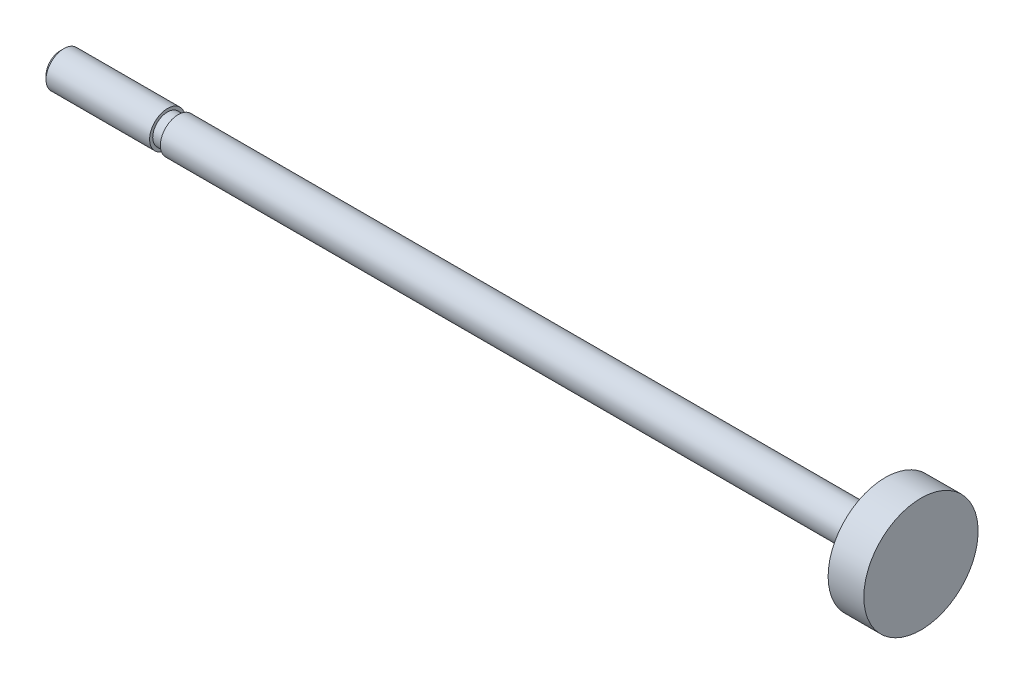
ISO-10303-21;
HEADER;
FILE_DESCRIPTION(('STEP AP214'),'2;1');
FILE_NAME('part.step','',(''),(''),'','','');
FILE_SCHEMA(('AUTOMOTIVE_DESIGN { 1 0 10303 214 1 1 1 1 }'));
ENDSEC;
DATA;
#1=APPLICATION_CONTEXT('core data for automotive mechanical design processes');
#2=APPLICATION_PROTOCOL_DEFINITION('international standard','automotive_design',2000,#1);
#3=PRODUCT_CONTEXT('',#1,'mechanical');
#4=PRODUCT('Part','Part','',(#3));
#5=PRODUCT_RELATED_PRODUCT_CATEGORY('part','',(#4));
#6=PRODUCT_DEFINITION_FORMATION('','',#4);
#7=PRODUCT_DEFINITION_CONTEXT('part definition',#1,'design');
#8=PRODUCT_DEFINITION('design','',#6,#7);
#9=PRODUCT_DEFINITION_SHAPE('','',#8);
#10=(LENGTH_UNIT() NAMED_UNIT(*) SI_UNIT(.MILLI.,.METRE.));
#11=(NAMED_UNIT(*) PLANE_ANGLE_UNIT() SI_UNIT($,.RADIAN.));
#12=(NAMED_UNIT(*) SI_UNIT($,.STERADIAN.) SOLID_ANGLE_UNIT());
#13=UNCERTAINTY_MEASURE_WITH_UNIT(LENGTH_MEASURE(1.E-05),#10,'distance_accuracy_value','');
#14=(GEOMETRIC_REPRESENTATION_CONTEXT(3) GLOBAL_UNCERTAINTY_ASSIGNED_CONTEXT((#13)) GLOBAL_UNIT_ASSIGNED_CONTEXT((#10,
#11,#12)) REPRESENTATION_CONTEXT('',''));
#15=CARTESIAN_POINT('',(0.,0.,0.));
#16=DIRECTION('',(0.,0.,1.));
#17=DIRECTION('',(1.,0.,0.));
#18=AXIS2_PLACEMENT_3D('',#15,#16,#17);
#19=CARTESIAN_POINT('',(0.,-2.0095,2.0095));
#20=DIRECTION('',(-1.,0.,0.));
#21=DIRECTION('',(0.,1.,0.));
#22=AXIS2_PLACEMENT_3D('',#19,#20,#21);
#23=PLANE('',#22);
#24=CARTESIAN_POINT('',(0.,0.,0.));
#25=DIRECTION('',(-1.,0.,0.));
#26=DIRECTION('',(0.,0.,-1.));
#27=AXIS2_PLACEMENT_3D('',#24,#25,#26);
#28=CIRCLE('',#27,2.0095);
#29=CARTESIAN_POINT('',(0.,0.,-2.0095));
#30=VERTEX_POINT('',#29);
#31=EDGE_CURVE('E47',#30,#30,#28,.F.);
#32=ORIENTED_EDGE('',*,*,#31,.F.);
#33=EDGE_LOOP('',(#32));
#34=FACE_BOUND('',#33,.T.);
#35=ADVANCED_FACE('F15',(#34),#23,.T.);
#36=CARTESIAN_POINT('',(15.,-2.49999987914998,-2.5));
#37=DIRECTION('',(1.,0.,0.));
#38=DIRECTION('',(0.,1.,0.));
#39=AXIS2_PLACEMENT_3D('',#36,#37,#38);
#40=PLANE('',#39);
#41=CARTESIAN_POINT('',(15.,0.,0.));
#42=DIRECTION('',(1.,0.,0.));
#43=DIRECTION('',(0.,-1.41721898572201E-07,0.99999999999999));
#44=AXIS2_PLACEMENT_3D('',#41,#42,#43);
#45=CIRCLE('',#44,2.5);
#46=CARTESIAN_POINT('',(15.,-3.54304746430502E-07,2.49999999999997));
#47=VERTEX_POINT('',#46);
#48=EDGE_CURVE('E44',#47,#47,#45,.T.);
#49=ORIENTED_EDGE('',*,*,#48,.T.);
#50=EDGE_LOOP('',(#49));
#51=FACE_BOUND('',#50,.T.);
#52=CARTESIAN_POINT('',(15.,0.,0.));
#53=DIRECTION('',(-1.,0.,0.));
#54=DIRECTION('',(0.,0.,-1.));
#55=AXIS2_PLACEMENT_3D('',#52,#53,#54);
#56=CIRCLE('',#55,2.067);
#57=CARTESIAN_POINT('',(15.,0.,-2.067));
#58=VERTEX_POINT('',#57);
#59=EDGE_CURVE('E41',#58,#58,#56,.F.);
#60=ORIENTED_EDGE('',*,*,#59,.F.);
#61=EDGE_LOOP('',(#60));
#62=FACE_BOUND('',#61,.T.);
#63=ADVANCED_FACE('F54',(#51,#62),#40,.T.);
#64=CARTESIAN_POINT('',(16.5,-2.5,2.5));
#65=DIRECTION('',(-1.,0.,0.));
#66=DIRECTION('',(0.,1.,0.));
#67=AXIS2_PLACEMENT_3D('',#64,#65,#66);
#68=PLANE('',#67);
#69=CARTESIAN_POINT('',(16.5,0.,0.));
#70=DIRECTION('',(-1.,0.,0.));
#71=DIRECTION('',(0.,0.,-1.));
#72=AXIS2_PLACEMENT_3D('',#69,#70,#71);
#73=CIRCLE('',#72,2.5);
#74=CARTESIAN_POINT('',(16.5,0.,-2.5));
#75=VERTEX_POINT('',#74);
#76=EDGE_CURVE('E38',#75,#75,#73,.F.);
#77=ORIENTED_EDGE('',*,*,#76,.F.);
#78=EDGE_LOOP('',(#77));
#79=FACE_BOUND('',#78,.T.);
#80=CARTESIAN_POINT('',(16.5,0.,0.));
#81=DIRECTION('',(1.,0.,0.));
#82=DIRECTION('',(0.,-1.42019591163286E-07,0.99999999999999));
#83=AXIS2_PLACEMENT_3D('',#80,#81,#82);
#84=CIRCLE('',#83,2.067);
#85=CARTESIAN_POINT('',(16.5,-2.93554494934513E-07,2.06699999999998));
#86=VERTEX_POINT('',#85);
#87=EDGE_CURVE('E35',#86,#86,#84,.T.);
#88=ORIENTED_EDGE('',*,*,#87,.T.);
#89=EDGE_LOOP('',(#88));
#90=FACE_BOUND('',#89,.T.);
#91=ADVANCED_FACE('F60',(#79,#90),#68,.T.);
#92=CARTESIAN_POINT('',(115.5,-8.21859166127047,8.));
#93=DIRECTION('',(-1.,0.,0.));
#94=DIRECTION('',(0.,1.,0.));
#95=AXIS2_PLACEMENT_3D('',#92,#93,#94);
#96=PLANE('',#95);
#97=CARTESIAN_POINT('',(115.5,0.,0.));
#98=DIRECTION('',(-1.,0.,0.));
#99=DIRECTION('',(0.,0.,-1.));
#100=AXIS2_PLACEMENT_3D('',#97,#98,#99);
#101=CIRCLE('',#100,8.);
#102=CARTESIAN_POINT('',(115.5,0.,-8.));
#103=VERTEX_POINT('',#102);
#104=EDGE_CURVE('E30',#103,#103,#101,.F.);
#105=ORIENTED_EDGE('',*,*,#104,.F.);
#106=EDGE_LOOP('',(#105));
#107=FACE_BOUND('',#106,.T.);
#108=CARTESIAN_POINT('',(115.5,0.,0.));
#109=DIRECTION('',(1.,0.,0.));
#110=DIRECTION('',(0.,-1.42053902152386E-07,0.99999999999999));
#111=AXIS2_PLACEMENT_3D('',#108,#109,#110);
#112=CIRCLE('',#111,2.5);
#113=CARTESIAN_POINT('',(115.5,-3.55134755380964E-07,2.49999999999997));
#114=VERTEX_POINT('',#113);
#115=EDGE_CURVE('E26',#114,#114,#112,.T.);
#116=ORIENTED_EDGE('',*,*,#115,.T.);
#117=EDGE_LOOP('',(#116));
#118=FACE_BOUND('',#117,.T.);
#119=ADVANCED_FACE('F66',(#107,#118),#96,.T.);
#120=CARTESIAN_POINT('',(120.5,-8.21859166127047,-8.));
#121=DIRECTION('',(1.,0.,0.));
#122=DIRECTION('',(0.,1.,0.));
#123=AXIS2_PLACEMENT_3D('',#120,#121,#122);
#124=PLANE('',#123);
#125=CARTESIAN_POINT('',(120.5,0.,0.));
#126=DIRECTION('',(1.,0.,0.));
#127=DIRECTION('',(0.,0.,1.));
#128=AXIS2_PLACEMENT_3D('',#125,#126,#127);
#129=CIRCLE('',#128,8.);
#130=CARTESIAN_POINT('',(120.5,0.,8.));
#131=VERTEX_POINT('',#130);
#132=EDGE_CURVE('E22',#131,#131,#129,.T.);
#133=ORIENTED_EDGE('',*,*,#132,.T.);
#134=EDGE_LOOP('',(#133));
#135=FACE_BOUND('',#134,.T.);
#136=ADVANCED_FACE('F70',(#135),#124,.T.);
#137=CARTESIAN_POINT('',(0.490500000000003,0.,0.));
#138=DIRECTION('',(1.,0.,0.));
#139=DIRECTION('',(0.,1.92326721555755E-10,1.));
#140=AXIS2_PLACEMENT_3D('',#137,#138,#139);
#141=CONICAL_SURFACE('',#140,2.5,0.785398163397443);
#142=CARTESIAN_POINT('',(0.490500000000003,0.,0.));
#143=DIRECTION('',(-1.,0.,0.));
#144=DIRECTION('',(0.,0.,-1.));
#145=AXIS2_PLACEMENT_3D('',#142,#143,#144);
#146=CIRCLE('',#145,2.5);
#147=CARTESIAN_POINT('',(0.490500000000003,0.,-2.5));
#148=VERTEX_POINT('',#147);
#149=EDGE_CURVE('E10',#148,#148,#146,.F.);
#150=ORIENTED_EDGE('',*,*,#149,.F.);
#151=EDGE_LOOP('',(#150));
#152=FACE_BOUND('',#151,.T.);
#153=ORIENTED_EDGE('',*,*,#31,.T.);
#154=EDGE_LOOP('',(#153));
#155=FACE_BOUND('',#154,.T.);
#156=ADVANCED_FACE('F51',(#152,#155),#141,.T.);
#157=CARTESIAN_POINT('',(120.5,0.,0.));
#158=DIRECTION('',(1.,0.,0.));
#159=DIRECTION('',(0.,7.6930696291819E-10,1.));
#160=AXIS2_PLACEMENT_3D('',#157,#158,#159);
#161=CYLINDRICAL_SURFACE('',#160,2.5);
#162=ORIENTED_EDGE('',*,*,#48,.F.);
#163=EDGE_LOOP('',(#162));
#164=FACE_BOUND('',#163,.T.);
#165=ORIENTED_EDGE('',*,*,#149,.T.);
#166=EDGE_LOOP('',(#165));
#167=FACE_BOUND('',#166,.T.);
#168=ADVANCED_FACE('F76',(#164,#167),#161,.T.);
#169=CARTESIAN_POINT('',(120.5,0.,0.));
#170=DIRECTION('',(1.,0.,0.));
#171=DIRECTION('',(0.,1.41620379990111E-07,0.99999999999999));
#172=AXIS2_PLACEMENT_3D('',#169,#170,#171);
#173=CYLINDRICAL_SURFACE('',#172,2.067);
#174=ORIENTED_EDGE('',*,*,#87,.F.);
#175=EDGE_LOOP('',(#174));
#176=FACE_BOUND('',#175,.T.);
#177=ORIENTED_EDGE('',*,*,#59,.T.);
#178=EDGE_LOOP('',(#177));
#179=FACE_BOUND('',#178,.T.);
#180=ADVANCED_FACE('F80',(#176,#179),#173,.T.);
#181=CARTESIAN_POINT('',(120.5,0.,0.));
#182=DIRECTION('',(1.,0.,0.));
#183=DIRECTION('',(0.,0.,1.));
#184=AXIS2_PLACEMENT_3D('',#181,#182,#183);
#185=CYLINDRICAL_SURFACE('',#184,2.5);
#186=ORIENTED_EDGE('',*,*,#115,.F.);
#187=EDGE_LOOP('',(#186));
#188=FACE_BOUND('',#187,.T.);
#189=ORIENTED_EDGE('',*,*,#76,.T.);
#190=EDGE_LOOP('',(#189));
#191=FACE_BOUND('',#190,.T.);
#192=ADVANCED_FACE('F83',(#188,#191),#185,.T.);
#193=CARTESIAN_POINT('',(120.5,0.,0.));
#194=DIRECTION('',(1.,0.,0.));
#195=DIRECTION('',(0.,0.,1.));
#196=AXIS2_PLACEMENT_3D('',#193,#194,#195);
#197=CYLINDRICAL_SURFACE('',#196,8.);
#198=ORIENTED_EDGE('',*,*,#132,.F.);
#199=EDGE_LOOP('',(#198));
#200=FACE_BOUND('',#199,.T.);
#201=ORIENTED_EDGE('',*,*,#104,.T.);
#202=EDGE_LOOP('',(#201));
#203=FACE_BOUND('',#202,.T.);
#204=ADVANCED_FACE('F17',(#200,#203),#197,.T.);
#205=CLOSED_SHELL('',(#35,#63,#91,#119,#136,#156,#168,#180,#192,#204));
#206=MANIFOLD_SOLID_BREP('B1',#205);
#207=ADVANCED_BREP_SHAPE_REPRESENTATION('',(#18,#206),#14);
#208=SHAPE_DEFINITION_REPRESENTATION(#9,#207);
ENDSEC;
END-ISO-10303-21;
